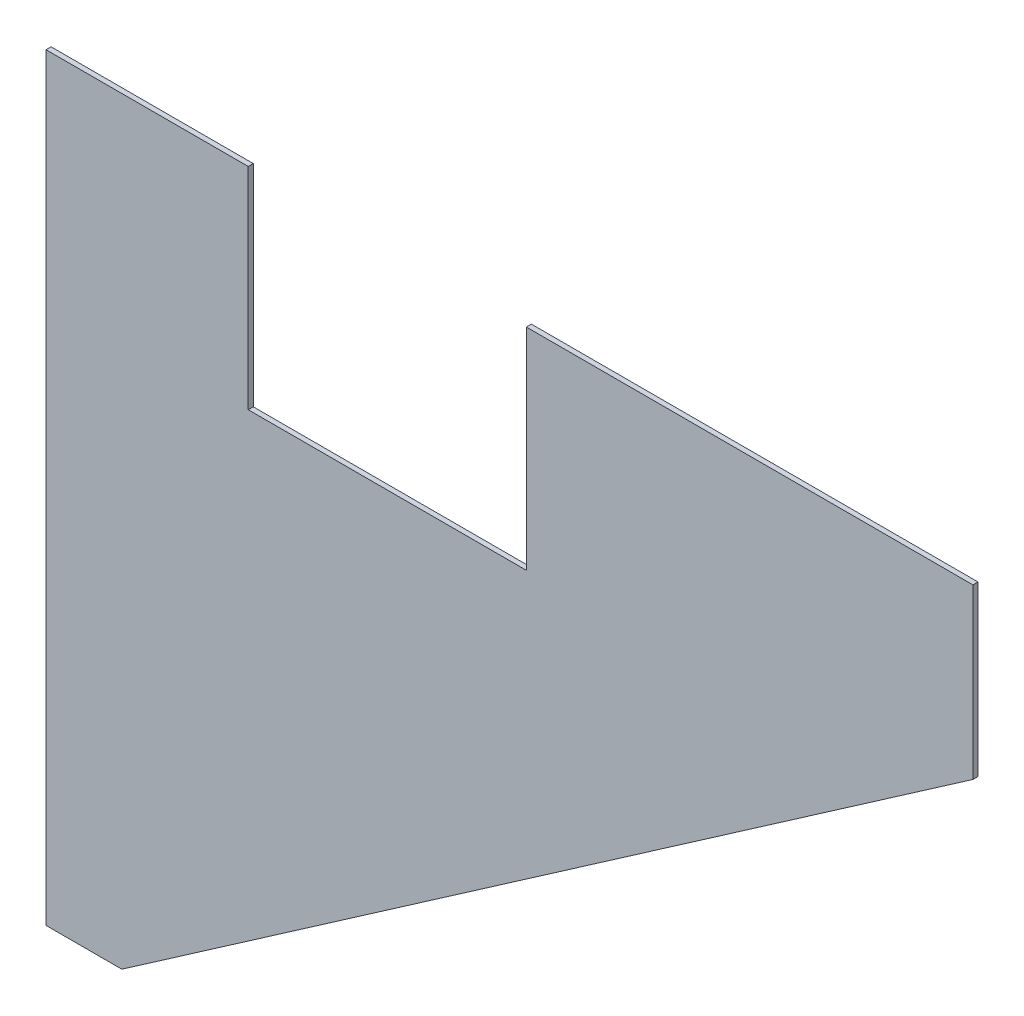
ISO-10303-21;
HEADER;
FILE_DESCRIPTION(('STEP AP214'),'2;1');
FILE_NAME('part.step','',(''),(''),'','','');
FILE_SCHEMA(('AUTOMOTIVE_DESIGN { 1 0 10303 214 1 1 1 1 }'));
ENDSEC;
DATA;
#1=APPLICATION_CONTEXT('core data for automotive mechanical design processes');
#2=APPLICATION_PROTOCOL_DEFINITION('international standard','automotive_design',2000,#1);
#3=PRODUCT_CONTEXT('',#1,'mechanical');
#4=PRODUCT('Part','Part','',(#3));
#5=PRODUCT_RELATED_PRODUCT_CATEGORY('part','',(#4));
#6=PRODUCT_DEFINITION_FORMATION('','',#4);
#7=PRODUCT_DEFINITION_CONTEXT('part definition',#1,'design');
#8=PRODUCT_DEFINITION('design','',#6,#7);
#9=PRODUCT_DEFINITION_SHAPE('','',#8);
#10=(LENGTH_UNIT() NAMED_UNIT(*) SI_UNIT(.MILLI.,.METRE.));
#11=(NAMED_UNIT(*) PLANE_ANGLE_UNIT() SI_UNIT($,.RADIAN.));
#12=(NAMED_UNIT(*) SI_UNIT($,.STERADIAN.) SOLID_ANGLE_UNIT());
#13=UNCERTAINTY_MEASURE_WITH_UNIT(LENGTH_MEASURE(1.E-05),#10,'distance_accuracy_value','');
#14=(GEOMETRIC_REPRESENTATION_CONTEXT(3) GLOBAL_UNCERTAINTY_ASSIGNED_CONTEXT((#13)) GLOBAL_UNIT_ASSIGNED_CONTEXT((#10,
#11,#12)) REPRESENTATION_CONTEXT('',''));
#15=CARTESIAN_POINT('',(0.,0.,0.));
#16=DIRECTION('',(0.,0.,1.));
#17=DIRECTION('',(1.,0.,0.));
#18=AXIS2_PLACEMENT_3D('',#15,#16,#17);
#19=CARTESIAN_POINT('',(0.,800.,6.));
#20=DIRECTION('',(0.,-1.,0.));
#21=DIRECTION('',(0.,0.,-1.));
#22=AXIS2_PLACEMENT_3D('',#19,#20,#21);
#23=PLANE('',#22);
#24=DIRECTION('',(-1.,0.,0.));
#25=VECTOR('',#24,1.);
#26=CARTESIAN_POINT('',(0.,800.,6.));
#27=LINE('',#26,#25);
#28=CARTESIAN_POINT('',(240.,800.,6.));
#29=VERTEX_POINT('',#28);
#30=CARTESIAN_POINT('',(0.,800.,6.));
#31=VERTEX_POINT('',#30);
#32=EDGE_CURVE('E88',#29,#31,#27,.T.);
#33=ORIENTED_EDGE('',*,*,#32,.F.);
#34=DIRECTION('',(0.,0.,1.));
#35=VECTOR('',#34,1.);
#36=CARTESIAN_POINT('',(240.,800.,0.));
#37=LINE('',#36,#35);
#38=CARTESIAN_POINT('',(240.,800.,0.));
#39=VERTEX_POINT('',#38);
#40=EDGE_CURVE('E139',#39,#29,#37,.T.);
#41=ORIENTED_EDGE('',*,*,#40,.F.);
#42=DIRECTION('',(-1.,0.,0.));
#43=VECTOR('',#42,1.);
#44=CARTESIAN_POINT('',(0.,800.,0.));
#45=LINE('',#44,#43);
#46=CARTESIAN_POINT('',(0.,800.,0.));
#47=VERTEX_POINT('',#46);
#48=EDGE_CURVE('E123',#39,#47,#45,.T.);
#49=ORIENTED_EDGE('',*,*,#48,.T.);
#50=DIRECTION('',(0.,0.,-1.));
#51=VECTOR('',#50,1.);
#52=CARTESIAN_POINT('',(0.,800.,6.));
#53=LINE('',#52,#51);
#54=EDGE_CURVE('E45',#31,#47,#53,.T.);
#55=ORIENTED_EDGE('',*,*,#54,.F.);
#56=EDGE_LOOP('',(#33,#41,#49,#55));
#57=FACE_BOUND('',#56,.T.);
#58=ADVANCED_FACE('F36',(#57),#23,.F.);
#59=CARTESIAN_POINT('',(1100.,800.,0.));
#60=VERTEX_POINT('',#59);
#61=CARTESIAN_POINT('',(570.,800.,0.));
#62=VERTEX_POINT('',#61);
#63=EDGE_CURVE('E119',#60,#62,#45,.T.);
#64=ORIENTED_EDGE('',*,*,#63,.T.);
#65=DIRECTION('',(0.,0.,1.));
#66=VECTOR('',#65,1.);
#67=CARTESIAN_POINT('',(570.,800.,-4.));
#68=LINE('',#67,#66);
#69=CARTESIAN_POINT('',(570.,800.,6.));
#70=VERTEX_POINT('',#69);
#71=EDGE_CURVE('E152',#62,#70,#68,.T.);
#72=ORIENTED_EDGE('',*,*,#71,.T.);
#73=CARTESIAN_POINT('',(1100.,800.,6.));
#74=VERTEX_POINT('',#73);
#75=EDGE_CURVE('E186',#74,#70,#27,.T.);
#76=ORIENTED_EDGE('',*,*,#75,.F.);
#77=DIRECTION('',(0.,0.,-1.));
#78=VECTOR('',#77,1.);
#79=CARTESIAN_POINT('',(1100.,800.,6.));
#80=LINE('',#79,#78);
#81=EDGE_CURVE('E115',#74,#60,#80,.T.);
#82=ORIENTED_EDGE('',*,*,#81,.T.);
#83=EDGE_LOOP('',(#64,#72,#76,#82));
#84=FACE_BOUND('',#83,.T.);
#85=ADVANCED_FACE('F38',(#84),#23,.F.);
#86=CARTESIAN_POINT('',(0.,-100.,6.));
#87=DIRECTION('',(1.,0.,0.));
#88=DIRECTION('',(0.,0.,-1.));
#89=AXIS2_PLACEMENT_3D('',#86,#87,#88);
#90=PLANE('',#89);
#91=DIRECTION('',(0.,-1.,0.));
#92=VECTOR('',#91,1.);
#93=CARTESIAN_POINT('',(0.,-100.,0.));
#94=LINE('',#93,#92);
#95=CARTESIAN_POINT('',(0.,-100.,0.));
#96=VERTEX_POINT('',#95);
#97=EDGE_CURVE('E122',#47,#96,#94,.T.);
#98=ORIENTED_EDGE('',*,*,#97,.T.);
#99=DIRECTION('',(0.,0.,-1.));
#100=VECTOR('',#99,1.);
#101=CARTESIAN_POINT('',(0.,-100.,6.));
#102=LINE('',#101,#100);
#103=CARTESIAN_POINT('',(0.,-100.,6.));
#104=VERTEX_POINT('',#103);
#105=EDGE_CURVE('E110',#104,#96,#102,.T.);
#106=ORIENTED_EDGE('',*,*,#105,.F.);
#107=DIRECTION('',(0.,-1.,0.));
#108=VECTOR('',#107,1.);
#109=CARTESIAN_POINT('',(0.,-100.,6.));
#110=LINE('',#109,#108);
#111=EDGE_CURVE('E101',#31,#104,#110,.T.);
#112=ORIENTED_EDGE('',*,*,#111,.F.);
#113=ORIENTED_EDGE('',*,*,#54,.T.);
#114=EDGE_LOOP('',(#98,#106,#112,#113));
#115=FACE_BOUND('',#114,.T.);
#116=ADVANCED_FACE('F133',(#115),#90,.F.);
#117=CARTESIAN_POINT('',(0.,-100.,6.));
#118=DIRECTION('',(0.,1.,0.));
#119=DIRECTION('',(0.,0.,1.));
#120=AXIS2_PLACEMENT_3D('',#117,#118,#119);
#121=PLANE('',#120);
#122=DIRECTION('',(1.,0.,0.));
#123=VECTOR('',#122,1.);
#124=CARTESIAN_POINT('',(0.,-100.,0.));
#125=LINE('',#124,#123);
#126=CARTESIAN_POINT('',(90.,-100.,0.));
#127=VERTEX_POINT('',#126);
#128=EDGE_CURVE('E109',#96,#127,#125,.T.);
#129=ORIENTED_EDGE('',*,*,#128,.T.);
#130=DIRECTION('',(0.,0.,-1.));
#131=VECTOR('',#130,1.);
#132=CARTESIAN_POINT('',(90.,-100.,6.));
#133=LINE('',#132,#131);
#134=CARTESIAN_POINT('',(90.,-100.,6.));
#135=VERTEX_POINT('',#134);
#136=EDGE_CURVE('E106',#135,#127,#133,.T.);
#137=ORIENTED_EDGE('',*,*,#136,.F.);
#138=DIRECTION('',(1.,0.,0.));
#139=VECTOR('',#138,1.);
#140=CARTESIAN_POINT('',(0.,-100.,6.));
#141=LINE('',#140,#139);
#142=EDGE_CURVE('E96',#104,#135,#141,.T.);
#143=ORIENTED_EDGE('',*,*,#142,.F.);
#144=ORIENTED_EDGE('',*,*,#105,.T.);
#145=EDGE_LOOP('',(#129,#137,#143,#144));
#146=FACE_BOUND('',#145,.T.);
#147=ADVANCED_FACE('F107',(#146),#121,.F.);
#148=CARTESIAN_POINT('',(1100.,600.,6.));
#149=DIRECTION('',(-0.569633059430251,0.821899128606505,0.));
#150=DIRECTION('',(-0.821899128606505,-0.569633059430251,0.));
#151=AXIS2_PLACEMENT_3D('',#148,#149,#150);
#152=PLANE('',#151);
#153=DIRECTION('',(0.821899128606505,0.569633059430251,0.));
#154=VECTOR('',#153,1.);
#155=CARTESIAN_POINT('',(1100.,600.,0.));
#156=LINE('',#155,#154);
#157=CARTESIAN_POINT('',(1100.,600.,0.));
#158=VERTEX_POINT('',#157);
#159=EDGE_CURVE('E74',#127,#158,#156,.T.);
#160=ORIENTED_EDGE('',*,*,#159,.T.);
#161=DIRECTION('',(0.,0.,-1.));
#162=VECTOR('',#161,1.);
#163=CARTESIAN_POINT('',(1100.,600.,6.));
#164=LINE('',#163,#162);
#165=CARTESIAN_POINT('',(1100.,600.,6.));
#166=VERTEX_POINT('',#165);
#167=EDGE_CURVE('E111',#166,#158,#164,.T.);
#168=ORIENTED_EDGE('',*,*,#167,.F.);
#169=DIRECTION('',(0.821899128606505,0.569633059430251,0.));
#170=VECTOR('',#169,1.);
#171=CARTESIAN_POINT('',(1100.,600.,6.));
#172=LINE('',#171,#170);
#173=EDGE_CURVE('E100',#135,#166,#172,.T.);
#174=ORIENTED_EDGE('',*,*,#173,.F.);
#175=ORIENTED_EDGE('',*,*,#136,.T.);
#176=EDGE_LOOP('',(#160,#168,#174,#175));
#177=FACE_BOUND('',#176,.T.);
#178=ADVANCED_FACE('F113',(#177),#152,.F.);
#179=CARTESIAN_POINT('',(1100.,800.,6.));
#180=DIRECTION('',(-1.,0.,0.));
#181=DIRECTION('',(0.,0.,1.));
#182=AXIS2_PLACEMENT_3D('',#179,#180,#181);
#183=PLANE('',#182);
#184=DIRECTION('',(0.,1.,0.));
#185=VECTOR('',#184,1.);
#186=CARTESIAN_POINT('',(1100.,800.,0.));
#187=LINE('',#186,#185);
#188=EDGE_CURVE('E80',#158,#60,#187,.T.);
#189=ORIENTED_EDGE('',*,*,#188,.T.);
#190=ORIENTED_EDGE('',*,*,#81,.F.);
#191=DIRECTION('',(0.,1.,0.));
#192=VECTOR('',#191,1.);
#193=CARTESIAN_POINT('',(1100.,800.,6.));
#194=LINE('',#193,#192);
#195=EDGE_CURVE('E53',#166,#74,#194,.T.);
#196=ORIENTED_EDGE('',*,*,#195,.F.);
#197=ORIENTED_EDGE('',*,*,#167,.T.);
#198=EDGE_LOOP('',(#189,#190,#196,#197));
#199=FACE_BOUND('',#198,.T.);
#200=ADVANCED_FACE('F218',(#199),#183,.F.);
#201=CARTESIAN_POINT('',(0.,0.,6.));
#202=DIRECTION('',(0.,0.,-1.));
#203=DIRECTION('',(-1.,0.,0.));
#204=AXIS2_PLACEMENT_3D('',#201,#202,#203);
#205=PLANE('',#204);
#206=ORIENTED_EDGE('',*,*,#75,.T.);
#207=DIRECTION('',(0.,1.,0.));
#208=VECTOR('',#207,1.);
#209=CARTESIAN_POINT('',(570.,550.,6.));
#210=LINE('',#209,#208);
#211=CARTESIAN_POINT('',(570.,550.,6.));
#212=VERTEX_POINT('',#211);
#213=EDGE_CURVE('E190',#212,#70,#210,.T.);
#214=ORIENTED_EDGE('',*,*,#213,.F.);
#215=DIRECTION('',(1.,0.,0.));
#216=VECTOR('',#215,1.);
#217=CARTESIAN_POINT('',(240.,550.,6.));
#218=LINE('',#217,#216);
#219=CARTESIAN_POINT('',(240.,550.,6.));
#220=VERTEX_POINT('',#219);
#221=EDGE_CURVE('E173',#220,#212,#218,.T.);
#222=ORIENTED_EDGE('',*,*,#221,.F.);
#223=DIRECTION('',(0.,-1.,0.));
#224=VECTOR('',#223,1.);
#225=CARTESIAN_POINT('',(240.,800.,6.));
#226=LINE('',#225,#224);
#227=EDGE_CURVE('E177',#29,#220,#226,.T.);
#228=ORIENTED_EDGE('',*,*,#227,.F.);
#229=ORIENTED_EDGE('',*,*,#32,.T.);
#230=ORIENTED_EDGE('',*,*,#111,.T.);
#231=ORIENTED_EDGE('',*,*,#142,.T.);
#232=ORIENTED_EDGE('',*,*,#173,.T.);
#233=ORIENTED_EDGE('',*,*,#195,.T.);
#234=EDGE_LOOP('',(#206,#214,#222,#228,#229,#230,#231,#232,#233));
#235=FACE_BOUND('',#234,.T.);
#236=ADVANCED_FACE('F98',(#235),#205,.F.);
#237=CARTESIAN_POINT('',(0.,0.,0.));
#238=DIRECTION('',(0.,0.,-1.));
#239=DIRECTION('',(-1.,0.,0.));
#240=AXIS2_PLACEMENT_3D('',#237,#238,#239);
#241=PLANE('',#240);
#242=DIRECTION('',(0.,-1.,0.));
#243=VECTOR('',#242,1.);
#244=CARTESIAN_POINT('',(570.,0.,0.));
#245=LINE('',#244,#243);
#246=CARTESIAN_POINT('',(570.,550.,0.));
#247=VERTEX_POINT('',#246);
#248=EDGE_CURVE('E11',#62,#247,#245,.T.);
#249=ORIENTED_EDGE('',*,*,#248,.F.);
#250=ORIENTED_EDGE('',*,*,#63,.F.);
#251=ORIENTED_EDGE('',*,*,#188,.F.);
#252=ORIENTED_EDGE('',*,*,#159,.F.);
#253=ORIENTED_EDGE('',*,*,#128,.F.);
#254=ORIENTED_EDGE('',*,*,#97,.F.);
#255=ORIENTED_EDGE('',*,*,#48,.F.);
#256=DIRECTION('',(0.,-1.,0.));
#257=VECTOR('',#256,1.);
#258=CARTESIAN_POINT('',(240.,800.,0.));
#259=LINE('',#258,#257);
#260=CARTESIAN_POINT('',(240.,550.,0.));
#261=VERTEX_POINT('',#260);
#262=EDGE_CURVE('E167',#39,#261,#259,.T.);
#263=ORIENTED_EDGE('',*,*,#262,.T.);
#264=DIRECTION('',(1.,0.,0.));
#265=VECTOR('',#264,1.);
#266=CARTESIAN_POINT('',(240.,550.,0.));
#267=LINE('',#266,#265);
#268=EDGE_CURVE('E172',#261,#247,#267,.T.);
#269=ORIENTED_EDGE('',*,*,#268,.T.);
#270=EDGE_LOOP('',(#249,#250,#251,#252,#253,#254,#255,#263,#269));
#271=FACE_BOUND('',#270,.T.);
#272=ADVANCED_FACE('F143',(#271),#241,.T.);
#273=CARTESIAN_POINT('',(240.,800.,0.));
#274=DIRECTION('',(-1.,0.,0.));
#275=DIRECTION('',(0.,0.,1.));
#276=AXIS2_PLACEMENT_3D('',#273,#274,#275);
#277=PLANE('',#276);
#278=ORIENTED_EDGE('',*,*,#227,.T.);
#279=DIRECTION('',(0.,0.,1.));
#280=VECTOR('',#279,1.);
#281=CARTESIAN_POINT('',(240.,550.,0.));
#282=LINE('',#281,#280);
#283=EDGE_CURVE('E170',#261,#220,#282,.T.);
#284=ORIENTED_EDGE('',*,*,#283,.F.);
#285=ORIENTED_EDGE('',*,*,#262,.F.);
#286=ORIENTED_EDGE('',*,*,#40,.T.);
#287=EDGE_LOOP('',(#278,#284,#285,#286));
#288=FACE_BOUND('',#287,.T.);
#289=ADVANCED_FACE('F169',(#288),#277,.F.);
#290=CARTESIAN_POINT('',(240.,550.,0.));
#291=DIRECTION('',(0.,-1.,0.));
#292=DIRECTION('',(0.,0.,-1.));
#293=AXIS2_PLACEMENT_3D('',#290,#291,#292);
#294=PLANE('',#293);
#295=ORIENTED_EDGE('',*,*,#221,.T.);
#296=DIRECTION('',(0.,0.,1.));
#297=VECTOR('',#296,1.);
#298=CARTESIAN_POINT('',(570.,550.,-4.));
#299=LINE('',#298,#297);
#300=EDGE_CURVE('E180',#247,#212,#299,.T.);
#301=ORIENTED_EDGE('',*,*,#300,.F.);
#302=ORIENTED_EDGE('',*,*,#268,.F.);
#303=ORIENTED_EDGE('',*,*,#283,.T.);
#304=EDGE_LOOP('',(#295,#301,#302,#303));
#305=FACE_BOUND('',#304,.T.);
#306=ADVANCED_FACE('F195',(#305),#294,.F.);
#307=CARTESIAN_POINT('',(570.,550.,-4.));
#308=DIRECTION('',(1.,0.,0.));
#309=DIRECTION('',(0.,0.,-1.));
#310=AXIS2_PLACEMENT_3D('',#307,#308,#309);
#311=PLANE('',#310);
#312=ORIENTED_EDGE('',*,*,#248,.T.);
#313=ORIENTED_EDGE('',*,*,#300,.T.);
#314=ORIENTED_EDGE('',*,*,#213,.T.);
#315=ORIENTED_EDGE('',*,*,#71,.F.);
#316=EDGE_LOOP('',(#312,#313,#314,#315));
#317=FACE_BOUND('',#316,.T.);
#318=ADVANCED_FACE('F196',(#317),#311,.F.);
#319=CLOSED_SHELL('',(#58,#85,#116,#147,#178,#200,#236,#272,#289,#306,#318));
#320=MANIFOLD_SOLID_BREP('B2',#319);
#321=ADVANCED_BREP_SHAPE_REPRESENTATION('',(#18,#320),#14);
#322=SHAPE_DEFINITION_REPRESENTATION(#9,#321);
ENDSEC;
END-ISO-10303-21;
